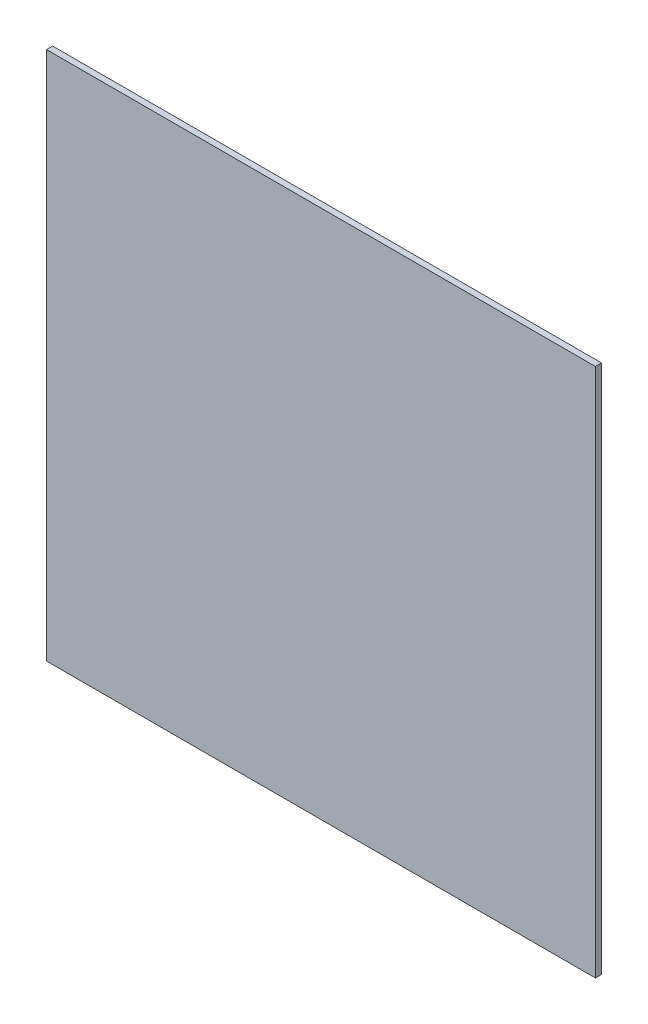
ISO-10303-21;
HEADER;
FILE_DESCRIPTION(('STEP AP214'),'2;1');
FILE_NAME('part.step','',(''),(''),'','','');
FILE_SCHEMA(('AUTOMOTIVE_DESIGN { 1 0 10303 214 1 1 1 1 }'));
ENDSEC;
DATA;
#1=APPLICATION_CONTEXT('core data for automotive mechanical design processes');
#2=APPLICATION_PROTOCOL_DEFINITION('international standard','automotive_design',2000,#1);
#3=PRODUCT_CONTEXT('',#1,'mechanical');
#4=PRODUCT('Part','Part','',(#3));
#5=PRODUCT_RELATED_PRODUCT_CATEGORY('part','',(#4));
#6=PRODUCT_DEFINITION_FORMATION('','',#4);
#7=PRODUCT_DEFINITION_CONTEXT('part definition',#1,'design');
#8=PRODUCT_DEFINITION('design','',#6,#7);
#9=PRODUCT_DEFINITION_SHAPE('','',#8);
#10=(LENGTH_UNIT() NAMED_UNIT(*) SI_UNIT(.MILLI.,.METRE.));
#11=(NAMED_UNIT(*) PLANE_ANGLE_UNIT() SI_UNIT($,.RADIAN.));
#12=(NAMED_UNIT(*) SI_UNIT($,.STERADIAN.) SOLID_ANGLE_UNIT());
#13=UNCERTAINTY_MEASURE_WITH_UNIT(LENGTH_MEASURE(1.E-05),#10,'distance_accuracy_value','');
#14=(GEOMETRIC_REPRESENTATION_CONTEXT(3) GLOBAL_UNCERTAINTY_ASSIGNED_CONTEXT((#13)) GLOBAL_UNIT_ASSIGNED_CONTEXT((#10,
#11,#12)) REPRESENTATION_CONTEXT('',''));
#15=CARTESIAN_POINT('',(0.,0.,0.));
#16=DIRECTION('',(0.,0.,1.));
#17=DIRECTION('',(1.,0.,0.));
#18=AXIS2_PLACEMENT_3D('',#15,#16,#17);
#19=CARTESIAN_POINT('',(0.,0.,2.85));
#20=DIRECTION('',(0.,0.,1.));
#21=DIRECTION('',(1.,0.,0.));
#22=AXIS2_PLACEMENT_3D('',#19,#20,#21);
#23=PLANE('',#22);
#24=DIRECTION('',(0.,1.,0.));
#25=VECTOR('',#24,1.);
#26=CARTESIAN_POINT('',(-256.0325,-247.,2.85));
#27=LINE('',#26,#25);
#28=CARTESIAN_POINT('',(-256.0325,-247.,2.85));
#29=VERTEX_POINT('',#28);
#30=CARTESIAN_POINT('',(-256.0325,247.,2.85));
#31=VERTEX_POINT('',#30);
#32=EDGE_CURVE('E67',#29,#31,#27,.T.);
#33=ORIENTED_EDGE('',*,*,#32,.F.);
#34=DIRECTION('',(1.,0.,0.));
#35=VECTOR('',#34,1.);
#36=CARTESIAN_POINT('',(256.0325,-247.,2.85));
#37=LINE('',#36,#35);
#38=CARTESIAN_POINT('',(256.0325,-247.,2.85));
#39=VERTEX_POINT('',#38);
#40=EDGE_CURVE('E19',#39,#29,#37,.F.);
#41=ORIENTED_EDGE('',*,*,#40,.F.);
#42=DIRECTION('',(0.,1.,0.));
#43=VECTOR('',#42,1.);
#44=CARTESIAN_POINT('',(256.0325,247.,2.85));
#45=LINE('',#44,#43);
#46=CARTESIAN_POINT('',(256.0325,247.,2.85));
#47=VERTEX_POINT('',#46);
#48=EDGE_CURVE('E57',#47,#39,#45,.F.);
#49=ORIENTED_EDGE('',*,*,#48,.F.);
#50=DIRECTION('',(1.,0.,0.));
#51=VECTOR('',#50,1.);
#52=CARTESIAN_POINT('',(-256.0325,247.,2.85));
#53=LINE('',#52,#51);
#54=EDGE_CURVE('E52',#31,#47,#53,.T.);
#55=ORIENTED_EDGE('',*,*,#54,.F.);
#56=EDGE_LOOP('',(#33,#41,#49,#55));
#57=FACE_BOUND('',#56,.T.);
#58=ADVANCED_FACE('F16',(#57),#23,.T.);
#59=CARTESIAN_POINT('',(256.0325,-247.,0.));
#60=DIRECTION('',(0.,-1.,0.));
#61=DIRECTION('',(0.,0.,-1.));
#62=AXIS2_PLACEMENT_3D('',#59,#60,#61);
#63=PLANE('',#62);
#64=DIRECTION('',(1.,0.,0.));
#65=VECTOR('',#64,1.);
#66=CARTESIAN_POINT('',(0.,-247.,-2.85));
#67=LINE('',#66,#65);
#68=CARTESIAN_POINT('',(-256.0325,-247.,-2.85));
#69=VERTEX_POINT('',#68);
#70=CARTESIAN_POINT('',(256.0325,-247.,-2.85));
#71=VERTEX_POINT('',#70);
#72=EDGE_CURVE('E73',#69,#71,#67,.T.);
#73=ORIENTED_EDGE('',*,*,#72,.T.);
#74=DIRECTION('',(0.,0.,-1.));
#75=VECTOR('',#74,1.);
#76=CARTESIAN_POINT('',(256.0325,-247.,0.));
#77=LINE('',#76,#75);
#78=EDGE_CURVE('E62',#39,#71,#77,.T.);
#79=ORIENTED_EDGE('',*,*,#78,.F.);
#80=ORIENTED_EDGE('',*,*,#40,.T.);
#81=DIRECTION('',(0.,0.,1.));
#82=VECTOR('',#81,1.);
#83=CARTESIAN_POINT('',(-256.0325,-247.,0.));
#84=LINE('',#83,#82);
#85=EDGE_CURVE('E80',#69,#29,#84,.T.);
#86=ORIENTED_EDGE('',*,*,#85,.F.);
#87=EDGE_LOOP('',(#73,#79,#80,#86));
#88=FACE_BOUND('',#87,.T.);
#89=ADVANCED_FACE('F72',(#88),#63,.T.);
#90=CARTESIAN_POINT('',(256.0325,247.,0.));
#91=DIRECTION('',(1.,0.,0.));
#92=DIRECTION('',(0.,0.,-1.));
#93=AXIS2_PLACEMENT_3D('',#90,#91,#92);
#94=PLANE('',#93);
#95=DIRECTION('',(0.,1.,0.));
#96=VECTOR('',#95,1.);
#97=CARTESIAN_POINT('',(256.0325,0.,-2.85));
#98=LINE('',#97,#96);
#99=CARTESIAN_POINT('',(256.0325,247.,-2.85));
#100=VERTEX_POINT('',#99);
#101=EDGE_CURVE('E83',#71,#100,#98,.T.);
#102=ORIENTED_EDGE('',*,*,#101,.T.);
#103=DIRECTION('',(0.,0.,1.));
#104=VECTOR('',#103,1.);
#105=CARTESIAN_POINT('',(256.0325,247.,0.));
#106=LINE('',#105,#104);
#107=EDGE_CURVE('E64',#47,#100,#106,.F.);
#108=ORIENTED_EDGE('',*,*,#107,.F.);
#109=ORIENTED_EDGE('',*,*,#48,.T.);
#110=ORIENTED_EDGE('',*,*,#78,.T.);
#111=EDGE_LOOP('',(#102,#108,#109,#110));
#112=FACE_BOUND('',#111,.T.);
#113=ADVANCED_FACE('F60',(#112),#94,.T.);
#114=CARTESIAN_POINT('',(-256.0325,247.,0.));
#115=DIRECTION('',(0.,1.,0.));
#116=DIRECTION('',(0.,0.,1.));
#117=AXIS2_PLACEMENT_3D('',#114,#115,#116);
#118=PLANE('',#117);
#119=DIRECTION('',(1.,0.,0.));
#120=VECTOR('',#119,1.);
#121=CARTESIAN_POINT('',(0.,247.,-2.85));
#122=LINE('',#121,#120);
#123=CARTESIAN_POINT('',(-256.0325,247.,-2.85));
#124=VERTEX_POINT('',#123);
#125=EDGE_CURVE('E25',#100,#124,#122,.F.);
#126=ORIENTED_EDGE('',*,*,#125,.T.);
#127=DIRECTION('',(0.,0.,1.));
#128=VECTOR('',#127,1.);
#129=CARTESIAN_POINT('',(-256.0325,247.,0.));
#130=LINE('',#129,#128);
#131=EDGE_CURVE('E33',#31,#124,#130,.F.);
#132=ORIENTED_EDGE('',*,*,#131,.F.);
#133=ORIENTED_EDGE('',*,*,#54,.T.);
#134=ORIENTED_EDGE('',*,*,#107,.T.);
#135=EDGE_LOOP('',(#126,#132,#133,#134));
#136=FACE_BOUND('',#135,.T.);
#137=ADVANCED_FACE('F87',(#136),#118,.T.);
#138=CARTESIAN_POINT('',(-256.0325,-247.,0.));
#139=DIRECTION('',(-1.,0.,0.));
#140=DIRECTION('',(0.,0.,1.));
#141=AXIS2_PLACEMENT_3D('',#138,#139,#140);
#142=PLANE('',#141);
#143=DIRECTION('',(0.,1.,0.));
#144=VECTOR('',#143,1.);
#145=CARTESIAN_POINT('',(-256.0325,0.,-2.85));
#146=LINE('',#145,#144);
#147=EDGE_CURVE('E10',#124,#69,#146,.F.);
#148=ORIENTED_EDGE('',*,*,#147,.T.);
#149=ORIENTED_EDGE('',*,*,#85,.T.);
#150=ORIENTED_EDGE('',*,*,#32,.T.);
#151=ORIENTED_EDGE('',*,*,#131,.T.);
#152=EDGE_LOOP('',(#148,#149,#150,#151));
#153=FACE_BOUND('',#152,.T.);
#154=ADVANCED_FACE('F90',(#153),#142,.T.);
#155=CARTESIAN_POINT('',(0.,0.,-2.85));
#156=DIRECTION('',(0.,0.,1.));
#157=DIRECTION('',(1.,0.,0.));
#158=AXIS2_PLACEMENT_3D('',#155,#156,#157);
#159=PLANE('',#158);
#160=ORIENTED_EDGE('',*,*,#125,.F.);
#161=ORIENTED_EDGE('',*,*,#101,.F.);
#162=ORIENTED_EDGE('',*,*,#72,.F.);
#163=ORIENTED_EDGE('',*,*,#147,.F.);
#164=EDGE_LOOP('',(#160,#161,#162,#163));
#165=FACE_BOUND('',#164,.T.);
#166=ADVANCED_FACE('F89',(#165),#159,.F.);
#167=CLOSED_SHELL('',(#58,#89,#113,#137,#154,#166));
#168=MANIFOLD_SOLID_BREP('B1',#167);
#169=ADVANCED_BREP_SHAPE_REPRESENTATION('',(#18,#168),#14);
#170=SHAPE_DEFINITION_REPRESENTATION(#9,#169);
ENDSEC;
END-ISO-10303-21;
